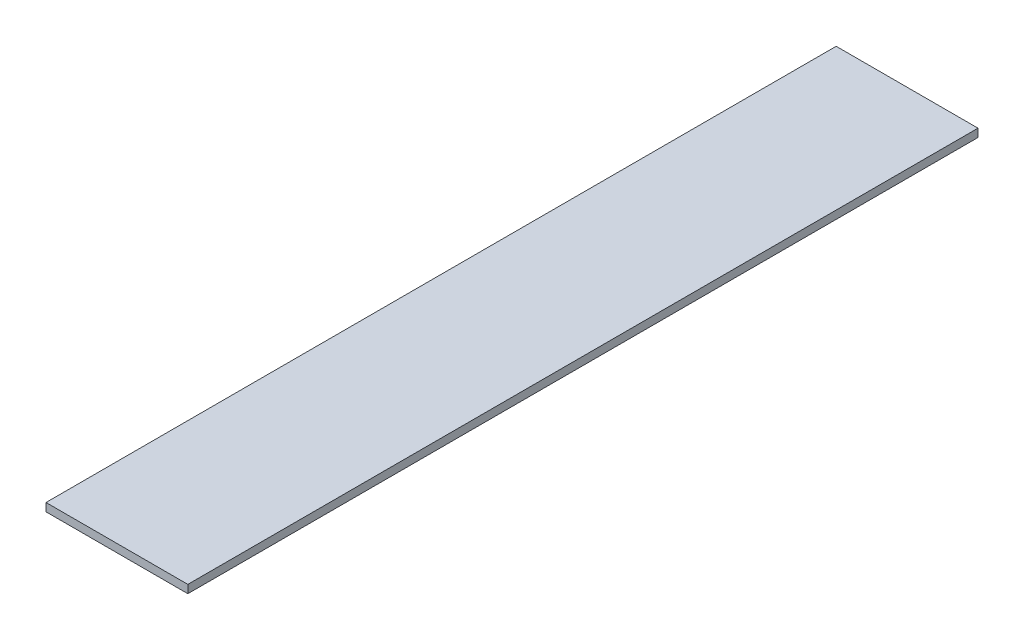
ISO-10303-21;
HEADER;
FILE_DESCRIPTION(('STEP AP214'),'2;1');
FILE_NAME('part.step','',(''),(''),'','','');
FILE_SCHEMA(('AUTOMOTIVE_DESIGN { 1 0 10303 214 1 1 1 1 }'));
ENDSEC;
DATA;
#1=APPLICATION_CONTEXT('core data for automotive mechanical design processes');
#2=APPLICATION_PROTOCOL_DEFINITION('international standard','automotive_design',2000,#1);
#3=PRODUCT_CONTEXT('',#1,'mechanical');
#4=PRODUCT('Part','Part','',(#3));
#5=PRODUCT_RELATED_PRODUCT_CATEGORY('part','',(#4));
#6=PRODUCT_DEFINITION_FORMATION('','',#4);
#7=PRODUCT_DEFINITION_CONTEXT('part definition',#1,'design');
#8=PRODUCT_DEFINITION('design','',#6,#7);
#9=PRODUCT_DEFINITION_SHAPE('','',#8);
#10=(LENGTH_UNIT() NAMED_UNIT(*) SI_UNIT(.MILLI.,.METRE.));
#11=(NAMED_UNIT(*) PLANE_ANGLE_UNIT() SI_UNIT($,.RADIAN.));
#12=(NAMED_UNIT(*) SI_UNIT($,.STERADIAN.) SOLID_ANGLE_UNIT());
#13=UNCERTAINTY_MEASURE_WITH_UNIT(LENGTH_MEASURE(1.E-05),#10,'distance_accuracy_value','');
#14=(GEOMETRIC_REPRESENTATION_CONTEXT(3) GLOBAL_UNCERTAINTY_ASSIGNED_CONTEXT((#13)) GLOBAL_UNIT_ASSIGNED_CONTEXT((#10,
#11,#12)) REPRESENTATION_CONTEXT('',''));
#15=CARTESIAN_POINT('',(0.,0.,0.));
#16=DIRECTION('',(0.,0.,1.));
#17=DIRECTION('',(1.,0.,0.));
#18=AXIS2_PLACEMENT_3D('',#15,#16,#17);
#19=CARTESIAN_POINT('',(0.,2.,0.));
#20=DIRECTION('',(1.,0.,0.));
#21=DIRECTION('',(0.,0.,-1.));
#22=AXIS2_PLACEMENT_3D('',#19,#20,#21);
#23=PLANE('',#22);
#24=DIRECTION('',(0.,0.,1.));
#25=VECTOR('',#24,1.);
#26=CARTESIAN_POINT('',(0.,0.,0.));
#27=LINE('',#26,#25);
#28=CARTESIAN_POINT('',(0.,0.,-195.));
#29=VERTEX_POINT('',#28);
#30=CARTESIAN_POINT('',(0.,0.,0.));
#31=VERTEX_POINT('',#30);
#32=EDGE_CURVE('E96',#29,#31,#27,.T.);
#33=ORIENTED_EDGE('',*,*,#32,.T.);
#34=DIRECTION('',(0.,-1.,0.));
#35=VECTOR('',#34,1.);
#36=CARTESIAN_POINT('',(0.,2.,0.));
#37=LINE('',#36,#35);
#38=CARTESIAN_POINT('',(0.,2.,0.));
#39=VERTEX_POINT('',#38);
#40=EDGE_CURVE('E11',#39,#31,#37,.T.);
#41=ORIENTED_EDGE('',*,*,#40,.F.);
#42=DIRECTION('',(0.,0.,1.));
#43=VECTOR('',#42,1.);
#44=CARTESIAN_POINT('',(0.,2.,0.));
#45=LINE('',#44,#43);
#46=CARTESIAN_POINT('',(0.,2.,-195.));
#47=VERTEX_POINT('',#46);
#48=EDGE_CURVE('E84',#47,#39,#45,.T.);
#49=ORIENTED_EDGE('',*,*,#48,.F.);
#50=DIRECTION('',(0.,-1.,0.));
#51=VECTOR('',#50,1.);
#52=CARTESIAN_POINT('',(0.,2.,-195.));
#53=LINE('',#52,#51);
#54=EDGE_CURVE('E92',#47,#29,#53,.T.);
#55=ORIENTED_EDGE('',*,*,#54,.T.);
#56=EDGE_LOOP('',(#33,#41,#49,#55));
#57=FACE_BOUND('',#56,.T.);
#58=ADVANCED_FACE('F33',(#57),#23,.F.);
#59=CARTESIAN_POINT('',(0.,2.,0.));
#60=DIRECTION('',(0.,0.,-1.));
#61=DIRECTION('',(-1.,0.,0.));
#62=AXIS2_PLACEMENT_3D('',#59,#60,#61);
#63=PLANE('',#62);
#64=DIRECTION('',(1.,0.,0.));
#65=VECTOR('',#64,1.);
#66=CARTESIAN_POINT('',(0.,0.,0.));
#67=LINE('',#66,#65);
#68=CARTESIAN_POINT('',(35.,0.,0.));
#69=VERTEX_POINT('',#68);
#70=EDGE_CURVE('E88',#31,#69,#67,.T.);
#71=ORIENTED_EDGE('',*,*,#70,.T.);
#72=DIRECTION('',(0.,-1.,0.));
#73=VECTOR('',#72,1.);
#74=CARTESIAN_POINT('',(35.,2.,0.));
#75=LINE('',#74,#73);
#76=CARTESIAN_POINT('',(35.,2.,0.));
#77=VERTEX_POINT('',#76);
#78=EDGE_CURVE('E41',#77,#69,#75,.T.);
#79=ORIENTED_EDGE('',*,*,#78,.F.);
#80=DIRECTION('',(1.,0.,0.));
#81=VECTOR('',#80,1.);
#82=CARTESIAN_POINT('',(0.,2.,0.));
#83=LINE('',#82,#81);
#84=EDGE_CURVE('E79',#39,#77,#83,.T.);
#85=ORIENTED_EDGE('',*,*,#84,.F.);
#86=ORIENTED_EDGE('',*,*,#40,.T.);
#87=EDGE_LOOP('',(#71,#79,#85,#86));
#88=FACE_BOUND('',#87,.T.);
#89=ADVANCED_FACE('F87',(#88),#63,.F.);
#90=CARTESIAN_POINT('',(35.,2.,0.));
#91=DIRECTION('',(-1.,0.,0.));
#92=DIRECTION('',(0.,0.,1.));
#93=AXIS2_PLACEMENT_3D('',#90,#91,#92);
#94=PLANE('',#93);
#95=DIRECTION('',(0.,0.,-1.));
#96=VECTOR('',#95,1.);
#97=CARTESIAN_POINT('',(35.,0.,0.));
#98=LINE('',#97,#96);
#99=CARTESIAN_POINT('',(35.,0.,-195.));
#100=VERTEX_POINT('',#99);
#101=EDGE_CURVE('E66',#69,#100,#98,.T.);
#102=ORIENTED_EDGE('',*,*,#101,.T.);
#103=DIRECTION('',(0.,-1.,0.));
#104=VECTOR('',#103,1.);
#105=CARTESIAN_POINT('',(35.,2.,-195.));
#106=LINE('',#105,#104);
#107=CARTESIAN_POINT('',(35.,2.,-195.));
#108=VERTEX_POINT('',#107);
#109=EDGE_CURVE('E89',#108,#100,#106,.T.);
#110=ORIENTED_EDGE('',*,*,#109,.F.);
#111=DIRECTION('',(0.,0.,-1.));
#112=VECTOR('',#111,1.);
#113=CARTESIAN_POINT('',(35.,2.,0.));
#114=LINE('',#113,#112);
#115=EDGE_CURVE('E82',#77,#108,#114,.T.);
#116=ORIENTED_EDGE('',*,*,#115,.F.);
#117=ORIENTED_EDGE('',*,*,#78,.T.);
#118=EDGE_LOOP('',(#102,#110,#116,#117));
#119=FACE_BOUND('',#118,.T.);
#120=ADVANCED_FACE('F90',(#119),#94,.F.);
#121=CARTESIAN_POINT('',(0.,2.,-195.));
#122=DIRECTION('',(0.,0.,1.));
#123=DIRECTION('',(1.,0.,0.));
#124=AXIS2_PLACEMENT_3D('',#121,#122,#123);
#125=PLANE('',#124);
#126=DIRECTION('',(-1.,0.,0.));
#127=VECTOR('',#126,1.);
#128=CARTESIAN_POINT('',(0.,0.,-195.));
#129=LINE('',#128,#127);
#130=EDGE_CURVE('E72',#100,#29,#129,.T.);
#131=ORIENTED_EDGE('',*,*,#130,.T.);
#132=ORIENTED_EDGE('',*,*,#54,.F.);
#133=DIRECTION('',(-1.,0.,0.));
#134=VECTOR('',#133,1.);
#135=CARTESIAN_POINT('',(0.,2.,-195.));
#136=LINE('',#135,#134);
#137=EDGE_CURVE('E49',#108,#47,#136,.T.);
#138=ORIENTED_EDGE('',*,*,#137,.F.);
#139=ORIENTED_EDGE('',*,*,#109,.T.);
#140=EDGE_LOOP('',(#131,#132,#138,#139));
#141=FACE_BOUND('',#140,.T.);
#142=ADVANCED_FACE('F103',(#141),#125,.F.);
#143=CARTESIAN_POINT('',(0.,2.,0.));
#144=DIRECTION('',(0.,-1.,0.));
#145=DIRECTION('',(0.,0.,-1.));
#146=AXIS2_PLACEMENT_3D('',#143,#144,#145);
#147=PLANE('',#146);
#148=ORIENTED_EDGE('',*,*,#48,.T.);
#149=ORIENTED_EDGE('',*,*,#84,.T.);
#150=ORIENTED_EDGE('',*,*,#115,.T.);
#151=ORIENTED_EDGE('',*,*,#137,.T.);
#152=EDGE_LOOP('',(#148,#149,#150,#151));
#153=FACE_BOUND('',#152,.T.);
#154=ADVANCED_FACE('F80',(#153),#147,.F.);
#155=CARTESIAN_POINT('',(0.,0.,0.));
#156=DIRECTION('',(0.,-1.,0.));
#157=DIRECTION('',(0.,0.,-1.));
#158=AXIS2_PLACEMENT_3D('',#155,#156,#157);
#159=PLANE('',#158);
#160=ORIENTED_EDGE('',*,*,#32,.F.);
#161=ORIENTED_EDGE('',*,*,#130,.F.);
#162=ORIENTED_EDGE('',*,*,#101,.F.);
#163=ORIENTED_EDGE('',*,*,#70,.F.);
#164=EDGE_LOOP('',(#160,#161,#162,#163));
#165=FACE_BOUND('',#164,.T.);
#166=ADVANCED_FACE('F106',(#165),#159,.T.);
#167=CLOSED_SHELL('',(#58,#89,#120,#142,#154,#166));
#168=MANIFOLD_SOLID_BREP('B2',#167);
#169=ADVANCED_BREP_SHAPE_REPRESENTATION('',(#18,#168),#14);
#170=SHAPE_DEFINITION_REPRESENTATION(#9,#169);
ENDSEC;
END-ISO-10303-21;
